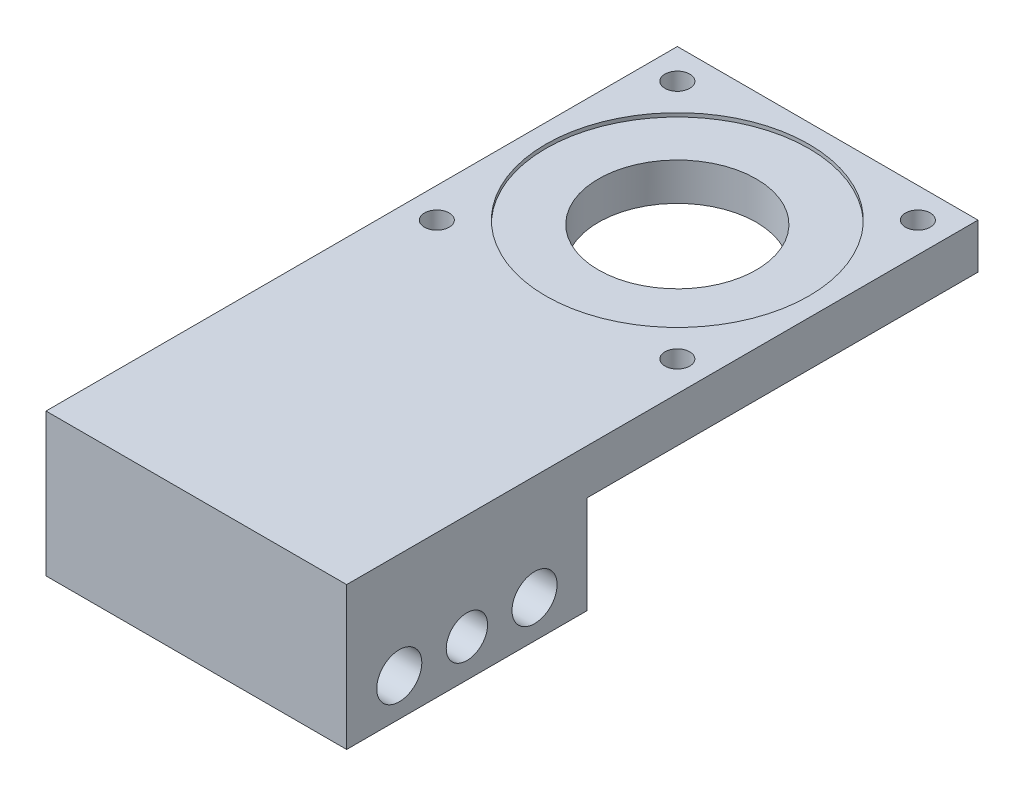
ISO-10303-21;
HEADER;
FILE_DESCRIPTION(('STEP AP214'),'2;1');
FILE_NAME('part.step','',(''),(''),'','','');
FILE_SCHEMA(('AUTOMOTIVE_DESIGN { 1 0 10303 214 1 1 1 1 }'));
ENDSEC;
DATA;
#1=APPLICATION_CONTEXT('core data for automotive mechanical design processes');
#2=APPLICATION_PROTOCOL_DEFINITION('international standard','automotive_design',2000,#1);
#3=PRODUCT_CONTEXT('',#1,'mechanical');
#4=PRODUCT('Part','Part','',(#3));
#5=PRODUCT_RELATED_PRODUCT_CATEGORY('part','',(#4));
#6=PRODUCT_DEFINITION_FORMATION('','',#4);
#7=PRODUCT_DEFINITION_CONTEXT('part definition',#1,'design');
#8=PRODUCT_DEFINITION('design','',#6,#7);
#9=PRODUCT_DEFINITION_SHAPE('','',#8);
#10=(LENGTH_UNIT() NAMED_UNIT(*) SI_UNIT(.MILLI.,.METRE.));
#11=(NAMED_UNIT(*) PLANE_ANGLE_UNIT() SI_UNIT($,.RADIAN.));
#12=(NAMED_UNIT(*) SI_UNIT($,.STERADIAN.) SOLID_ANGLE_UNIT());
#13=UNCERTAINTY_MEASURE_WITH_UNIT(LENGTH_MEASURE(1.E-05),#10,'distance_accuracy_value','');
#14=(GEOMETRIC_REPRESENTATION_CONTEXT(3) GLOBAL_UNCERTAINTY_ASSIGNED_CONTEXT((#13)) GLOBAL_UNIT_ASSIGNED_CONTEXT((#10,
#11,#12)) REPRESENTATION_CONTEXT('',''));
#15=CARTESIAN_POINT('',(0.,0.,0.));
#16=DIRECTION('',(0.,0.,1.));
#17=DIRECTION('',(1.,0.,0.));
#18=AXIS2_PLACEMENT_3D('',#15,#16,#17);
#19=CARTESIAN_POINT('',(0.,6.,0.));
#20=DIRECTION('',(0.,-1.,0.));
#21=DIRECTION('',(0.,0.,-1.));
#22=AXIS2_PLACEMENT_3D('',#19,#20,#21);
#23=CYLINDRICAL_SURFACE('',#22,10.5);
#24=CARTESIAN_POINT('',(0.,5.5,0.));
#25=DIRECTION('',(0.,1.,0.));
#26=DIRECTION('',(0.,0.,1.));
#27=AXIS2_PLACEMENT_3D('',#24,#25,#26);
#28=CIRCLE('',#27,10.5);
#29=CARTESIAN_POINT('',(0.,5.5,10.5));
#30=VERTEX_POINT('',#29);
#31=EDGE_CURVE('E173',#30,#30,#28,.T.);
#32=ORIENTED_EDGE('',*,*,#31,.T.);
#33=EDGE_LOOP('',(#32));
#34=FACE_BOUND('',#33,.T.);
#35=CARTESIAN_POINT('',(0.,0.5,0.));
#36=DIRECTION('',(0.,-1.,0.));
#37=DIRECTION('',(0.,0.,-1.));
#38=AXIS2_PLACEMENT_3D('',#35,#36,#37);
#39=CIRCLE('',#38,10.5);
#40=CARTESIAN_POINT('',(0.,0.5,-10.5));
#41=VERTEX_POINT('',#40);
#42=EDGE_CURVE('E59',#41,#41,#39,.T.);
#43=ORIENTED_EDGE('',*,*,#42,.T.);
#44=EDGE_LOOP('',(#43));
#45=FACE_BOUND('',#44,.T.);
#46=ADVANCED_FACE('F55',(#34,#45),#23,.F.);
#47=CARTESIAN_POINT('',(0.,0.,0.));
#48=DIRECTION('',(0.,1.,0.));
#49=DIRECTION('',(0.,0.,1.));
#50=AXIS2_PLACEMENT_3D('',#47,#48,#49);
#51=PLANE('',#50);
#52=CARTESIAN_POINT('',(0.,0.,0.));
#53=DIRECTION('',(0.,-1.,0.));
#54=DIRECTION('',(0.,0.,-1.));
#55=AXIS2_PLACEMENT_3D('',#52,#53,#54);
#56=CIRCLE('',#55,17.5);
#57=CARTESIAN_POINT('',(0.,0.,-17.5));
#58=VERTEX_POINT('',#57);
#59=EDGE_CURVE('E196',#58,#58,#56,.T.);
#60=ORIENTED_EDGE('',*,*,#59,.F.);
#61=EDGE_LOOP('',(#60));
#62=FACE_BOUND('',#61,.T.);
#63=CARTESIAN_POINT('',(-16.,0.,-16.));
#64=DIRECTION('',(0.,-1.,0.));
#65=DIRECTION('',(0.,0.,-1.));
#66=AXIS2_PLACEMENT_3D('',#63,#64,#65);
#67=CIRCLE('',#66,1.65);
#68=CARTESIAN_POINT('',(-16.,0.,-17.65));
#69=VERTEX_POINT('',#68);
#70=EDGE_CURVE('E176',#69,#69,#67,.T.);
#71=ORIENTED_EDGE('',*,*,#70,.F.);
#72=EDGE_LOOP('',(#71));
#73=FACE_BOUND('',#72,.T.);
#74=CARTESIAN_POINT('',(16.,0.,-16.));
#75=DIRECTION('',(0.,-1.,0.));
#76=DIRECTION('',(0.,0.,-1.));
#77=AXIS2_PLACEMENT_3D('',#74,#75,#76);
#78=CIRCLE('',#77,1.65);
#79=CARTESIAN_POINT('',(16.,0.,-17.65));
#80=VERTEX_POINT('',#79);
#81=EDGE_CURVE('E202',#80,#80,#78,.T.);
#82=ORIENTED_EDGE('',*,*,#81,.F.);
#83=EDGE_LOOP('',(#82));
#84=FACE_BOUND('',#83,.T.);
#85=CARTESIAN_POINT('',(16.,0.,16.));
#86=DIRECTION('',(0.,-1.,0.));
#87=DIRECTION('',(0.,0.,-1.));
#88=AXIS2_PLACEMENT_3D('',#85,#86,#87);
#89=CIRCLE('',#88,1.65);
#90=CARTESIAN_POINT('',(16.,0.,14.35));
#91=VERTEX_POINT('',#90);
#92=EDGE_CURVE('E210',#91,#91,#89,.T.);
#93=ORIENTED_EDGE('',*,*,#92,.F.);
#94=EDGE_LOOP('',(#93));
#95=FACE_BOUND('',#94,.T.);
#96=CARTESIAN_POINT('',(-16.,0.,16.));
#97=DIRECTION('',(0.,-1.,0.));
#98=DIRECTION('',(0.,0.,-1.));
#99=AXIS2_PLACEMENT_3D('',#96,#97,#98);
#100=CIRCLE('',#99,1.65);
#101=CARTESIAN_POINT('',(-16.,0.,14.35));
#102=VERTEX_POINT('',#101);
#103=EDGE_CURVE('E218',#102,#102,#100,.T.);
#104=ORIENTED_EDGE('',*,*,#103,.F.);
#105=EDGE_LOOP('',(#104));
#106=FACE_BOUND('',#105,.T.);
#107=DIRECTION('',(1.,0.,0.));
#108=VECTOR('',#107,1.);
#109=CARTESIAN_POINT('',(-20.,0.,32.));
#110=LINE('',#109,#108);
#111=CARTESIAN_POINT('',(-20.,0.,32.));
#112=VERTEX_POINT('',#111);
#113=CARTESIAN_POINT('',(20.,0.,32.));
#114=VERTEX_POINT('',#113);
#115=EDGE_CURVE('E73',#112,#114,#110,.T.);
#116=ORIENTED_EDGE('',*,*,#115,.F.);
#117=DIRECTION('',(0.,0.,1.));
#118=VECTOR('',#117,1.);
#119=CARTESIAN_POINT('',(-20.,0.,-20.));
#120=LINE('',#119,#118);
#121=CARTESIAN_POINT('',(-20.,0.,-20.));
#122=VERTEX_POINT('',#121);
#123=EDGE_CURVE('E140',#122,#112,#120,.T.);
#124=ORIENTED_EDGE('',*,*,#123,.F.);
#125=DIRECTION('',(-1.,0.,0.));
#126=VECTOR('',#125,1.);
#127=CARTESIAN_POINT('',(20.,0.,-20.));
#128=LINE('',#127,#126);
#129=CARTESIAN_POINT('',(20.,0.,-20.));
#130=VERTEX_POINT('',#129);
#131=EDGE_CURVE('E142',#130,#122,#128,.T.);
#132=ORIENTED_EDGE('',*,*,#131,.F.);
#133=DIRECTION('',(0.,0.,-1.));
#134=VECTOR('',#133,1.);
#135=CARTESIAN_POINT('',(20.,0.,64.));
#136=LINE('',#135,#134);
#137=EDGE_CURVE('E95',#114,#130,#136,.T.);
#138=ORIENTED_EDGE('',*,*,#137,.F.);
#139=EDGE_LOOP('',(#116,#124,#132,#138));
#140=FACE_BOUND('',#139,.T.);
#141=ADVANCED_FACE('F265',(#62,#73,#84,#95,#106,#140),#51,.F.);
#142=CARTESIAN_POINT('',(0.,6.,0.));
#143=DIRECTION('',(0.,1.,0.));
#144=DIRECTION('',(0.,0.,1.));
#145=AXIS2_PLACEMENT_3D('',#142,#143,#144);
#146=PLANE('',#145);
#147=CARTESIAN_POINT('',(0.,6.,0.));
#148=DIRECTION('',(0.,1.,0.));
#149=DIRECTION('',(0.,0.,1.));
#150=AXIS2_PLACEMENT_3D('',#147,#148,#149);
#151=CIRCLE('',#150,17.5);
#152=CARTESIAN_POINT('',(0.,6.,17.5));
#153=VERTEX_POINT('',#152);
#154=EDGE_CURVE('E187',#153,#153,#151,.T.);
#155=ORIENTED_EDGE('',*,*,#154,.F.);
#156=EDGE_LOOP('',(#155));
#157=FACE_BOUND('',#156,.T.);
#158=CARTESIAN_POINT('',(-16.,6.,-16.));
#159=DIRECTION('',(0.,-1.,0.));
#160=DIRECTION('',(0.,0.,-1.));
#161=AXIS2_PLACEMENT_3D('',#158,#159,#160);
#162=CIRCLE('',#161,1.65);
#163=CARTESIAN_POINT('',(-16.,6.,-17.65));
#164=VERTEX_POINT('',#163);
#165=EDGE_CURVE('E184',#164,#164,#162,.T.);
#166=ORIENTED_EDGE('',*,*,#165,.T.);
#167=EDGE_LOOP('',(#166));
#168=FACE_BOUND('',#167,.T.);
#169=CARTESIAN_POINT('',(16.,6.,-16.));
#170=DIRECTION('',(0.,-1.,0.));
#171=DIRECTION('',(0.,0.,-1.));
#172=AXIS2_PLACEMENT_3D('',#169,#170,#171);
#173=CIRCLE('',#172,1.65);
#174=CARTESIAN_POINT('',(16.,6.,-17.65));
#175=VERTEX_POINT('',#174);
#176=EDGE_CURVE('E206',#175,#175,#173,.T.);
#177=ORIENTED_EDGE('',*,*,#176,.T.);
#178=EDGE_LOOP('',(#177));
#179=FACE_BOUND('',#178,.T.);
#180=CARTESIAN_POINT('',(16.,6.,16.));
#181=DIRECTION('',(0.,-1.,0.));
#182=DIRECTION('',(0.,0.,-1.));
#183=AXIS2_PLACEMENT_3D('',#180,#181,#182);
#184=CIRCLE('',#183,1.65);
#185=CARTESIAN_POINT('',(16.,6.,14.35));
#186=VERTEX_POINT('',#185);
#187=EDGE_CURVE('E214',#186,#186,#184,.T.);
#188=ORIENTED_EDGE('',*,*,#187,.T.);
#189=EDGE_LOOP('',(#188));
#190=FACE_BOUND('',#189,.T.);
#191=CARTESIAN_POINT('',(-16.,6.,16.));
#192=DIRECTION('',(0.,-1.,0.));
#193=DIRECTION('',(0.,0.,-1.));
#194=AXIS2_PLACEMENT_3D('',#191,#192,#193);
#195=CIRCLE('',#194,1.65);
#196=CARTESIAN_POINT('',(-16.,6.,14.35));
#197=VERTEX_POINT('',#196);
#198=EDGE_CURVE('E222',#197,#197,#195,.T.);
#199=ORIENTED_EDGE('',*,*,#198,.T.);
#200=EDGE_LOOP('',(#199));
#201=FACE_BOUND('',#200,.T.);
#202=DIRECTION('',(-1.,0.,0.));
#203=VECTOR('',#202,1.);
#204=CARTESIAN_POINT('',(20.,6.,-20.));
#205=LINE('',#204,#203);
#206=CARTESIAN_POINT('',(20.,6.,-20.));
#207=VERTEX_POINT('',#206);
#208=CARTESIAN_POINT('',(-20.,6.,-20.));
#209=VERTEX_POINT('',#208);
#210=EDGE_CURVE('E152',#207,#209,#205,.T.);
#211=ORIENTED_EDGE('',*,*,#210,.T.);
#212=DIRECTION('',(0.,0.,1.));
#213=VECTOR('',#212,1.);
#214=CARTESIAN_POINT('',(-20.,6.,-20.));
#215=LINE('',#214,#213);
#216=CARTESIAN_POINT('',(-20.,6.,64.));
#217=VERTEX_POINT('',#216);
#218=EDGE_CURVE('E102',#209,#217,#215,.T.);
#219=ORIENTED_EDGE('',*,*,#218,.T.);
#220=DIRECTION('',(1.,0.,0.));
#221=VECTOR('',#220,1.);
#222=CARTESIAN_POINT('',(-20.,6.,64.));
#223=LINE('',#222,#221);
#224=CARTESIAN_POINT('',(20.,6.,64.));
#225=VERTEX_POINT('',#224);
#226=EDGE_CURVE('E157',#217,#225,#223,.T.);
#227=ORIENTED_EDGE('',*,*,#226,.T.);
#228=DIRECTION('',(0.,0.,-1.));
#229=VECTOR('',#228,1.);
#230=CARTESIAN_POINT('',(20.,6.,64.));
#231=LINE('',#230,#229);
#232=EDGE_CURVE('E82',#225,#207,#231,.T.);
#233=ORIENTED_EDGE('',*,*,#232,.T.);
#234=EDGE_LOOP('',(#211,#219,#227,#233));
#235=FACE_BOUND('',#234,.T.);
#236=ADVANCED_FACE('F260',(#157,#168,#179,#190,#201,#235),#146,.T.);
#237=CARTESIAN_POINT('',(20.,6.,-20.));
#238=DIRECTION('',(0.,0.,1.));
#239=DIRECTION('',(1.,0.,0.));
#240=AXIS2_PLACEMENT_3D('',#237,#238,#239);
#241=PLANE('',#240);
#242=ORIENTED_EDGE('',*,*,#131,.T.);
#243=DIRECTION('',(0.,-1.,0.));
#244=VECTOR('',#243,1.);
#245=CARTESIAN_POINT('',(-20.,6.,-20.));
#246=LINE('',#245,#244);
#247=EDGE_CURVE('E13',#209,#122,#246,.T.);
#248=ORIENTED_EDGE('',*,*,#247,.F.);
#249=ORIENTED_EDGE('',*,*,#210,.F.);
#250=DIRECTION('',(0.,-1.,0.));
#251=VECTOR('',#250,1.);
#252=CARTESIAN_POINT('',(20.,6.,-20.));
#253=LINE('',#252,#251);
#254=EDGE_CURVE('E161',#207,#130,#253,.T.);
#255=ORIENTED_EDGE('',*,*,#254,.T.);
#256=EDGE_LOOP('',(#242,#248,#249,#255));
#257=FACE_BOUND('',#256,.T.);
#258=ADVANCED_FACE('F57',(#257),#241,.F.);
#259=CARTESIAN_POINT('',(-20.,6.,-20.));
#260=DIRECTION('',(1.,0.,0.));
#261=DIRECTION('',(0.,0.,-1.));
#262=AXIS2_PLACEMENT_3D('',#259,#260,#261);
#263=PLANE('',#262);
#264=CARTESIAN_POINT('',(-20.,-8.,48.));
#265=DIRECTION('',(-1.,0.,0.));
#266=DIRECTION('',(0.,0.,1.));
#267=AXIS2_PLACEMENT_3D('',#264,#265,#266);
#268=CIRCLE('',#267,2.75);
#269=CARTESIAN_POINT('',(-20.,-8.,50.75));
#270=VERTEX_POINT('',#269);
#271=EDGE_CURVE('E226',#270,#270,#268,.T.);
#272=ORIENTED_EDGE('',*,*,#271,.F.);
#273=EDGE_LOOP('',(#272));
#274=FACE_BOUND('',#273,.T.);
#275=CARTESIAN_POINT('',(-20.,-8.,57.));
#276=DIRECTION('',(1.,0.,0.));
#277=DIRECTION('',(0.,0.,-1.));
#278=AXIS2_PLACEMENT_3D('',#275,#276,#277);
#279=CIRCLE('',#278,2.99999999999999);
#280=CARTESIAN_POINT('',(-20.,-8.,54.));
#281=VERTEX_POINT('',#280);
#282=EDGE_CURVE('E238',#281,#281,#279,.T.);
#283=ORIENTED_EDGE('',*,*,#282,.T.);
#284=EDGE_LOOP('',(#283));
#285=FACE_BOUND('',#284,.T.);
#286=CARTESIAN_POINT('',(-20.,-8.,39.));
#287=DIRECTION('',(1.,0.,0.));
#288=DIRECTION('',(0.,0.,-1.));
#289=AXIS2_PLACEMENT_3D('',#286,#287,#288);
#290=CIRCLE('',#289,2.99999999999999);
#291=CARTESIAN_POINT('',(-20.,-8.,36.));
#292=VERTEX_POINT('',#291);
#293=EDGE_CURVE('E246',#292,#292,#290,.T.);
#294=ORIENTED_EDGE('',*,*,#293,.T.);
#295=EDGE_LOOP('',(#294));
#296=FACE_BOUND('',#295,.T.);
#297=ORIENTED_EDGE('',*,*,#123,.T.);
#298=DIRECTION('',(0.,1.,0.));
#299=VECTOR('',#298,1.);
#300=CARTESIAN_POINT('',(-20.,-13.,32.));
#301=LINE('',#300,#299);
#302=CARTESIAN_POINT('',(-20.,-13.,32.));
#303=VERTEX_POINT('',#302);
#304=EDGE_CURVE('E123',#303,#112,#301,.T.);
#305=ORIENTED_EDGE('',*,*,#304,.F.);
#306=DIRECTION('',(0.,0.,-1.));
#307=VECTOR('',#306,1.);
#308=CARTESIAN_POINT('',(-20.,-13.,64.));
#309=LINE('',#308,#307);
#310=CARTESIAN_POINT('',(-20.,-13.,64.));
#311=VERTEX_POINT('',#310);
#312=EDGE_CURVE('E130',#311,#303,#309,.T.);
#313=ORIENTED_EDGE('',*,*,#312,.F.);
#314=DIRECTION('',(0.,-1.,0.));
#315=VECTOR('',#314,1.);
#316=CARTESIAN_POINT('',(-20.,6.,64.));
#317=LINE('',#316,#315);
#318=EDGE_CURVE('E65',#217,#311,#317,.T.);
#319=ORIENTED_EDGE('',*,*,#318,.F.);
#320=ORIENTED_EDGE('',*,*,#218,.F.);
#321=ORIENTED_EDGE('',*,*,#247,.T.);
#322=EDGE_LOOP('',(#297,#305,#313,#319,#320,#321));
#323=FACE_BOUND('',#322,.T.);
#324=ADVANCED_FACE('F139',(#274,#285,#296,#323),#263,.F.);
#325=CARTESIAN_POINT('',(-20.,6.,64.));
#326=DIRECTION('',(0.,0.,-1.));
#327=DIRECTION('',(-1.,0.,0.));
#328=AXIS2_PLACEMENT_3D('',#325,#326,#327);
#329=PLANE('',#328);
#330=ORIENTED_EDGE('',*,*,#318,.T.);
#331=DIRECTION('',(-1.,0.,0.));
#332=VECTOR('',#331,1.);
#333=CARTESIAN_POINT('',(-20.,-13.,64.));
#334=LINE('',#333,#332);
#335=CARTESIAN_POINT('',(20.,-13.,64.));
#336=VERTEX_POINT('',#335);
#337=EDGE_CURVE('E136',#336,#311,#334,.T.);
#338=ORIENTED_EDGE('',*,*,#337,.F.);
#339=DIRECTION('',(0.,-1.,0.));
#340=VECTOR('',#339,1.);
#341=CARTESIAN_POINT('',(20.,6.,64.));
#342=LINE('',#341,#340);
#343=EDGE_CURVE('E169',#225,#336,#342,.T.);
#344=ORIENTED_EDGE('',*,*,#343,.F.);
#345=ORIENTED_EDGE('',*,*,#226,.F.);
#346=EDGE_LOOP('',(#330,#338,#344,#345));
#347=FACE_BOUND('',#346,.T.);
#348=ADVANCED_FACE('F258',(#347),#329,.F.);
#349=CARTESIAN_POINT('',(20.,6.,64.));
#350=DIRECTION('',(-1.,0.,0.));
#351=DIRECTION('',(0.,0.,1.));
#352=AXIS2_PLACEMENT_3D('',#349,#350,#351);
#353=PLANE('',#352);
#354=CARTESIAN_POINT('',(20.,-8.,48.));
#355=DIRECTION('',(-1.,0.,0.));
#356=DIRECTION('',(0.,0.,1.));
#357=AXIS2_PLACEMENT_3D('',#354,#355,#356);
#358=CIRCLE('',#357,2.74999999999999);
#359=CARTESIAN_POINT('',(20.,-8.,50.75));
#360=VERTEX_POINT('',#359);
#361=EDGE_CURVE('E230',#360,#360,#358,.T.);
#362=ORIENTED_EDGE('',*,*,#361,.T.);
#363=EDGE_LOOP('',(#362));
#364=FACE_BOUND('',#363,.T.);
#365=CARTESIAN_POINT('',(20.,-8.,57.));
#366=DIRECTION('',(1.,0.,0.));
#367=DIRECTION('',(0.,0.,-1.));
#368=AXIS2_PLACEMENT_3D('',#365,#366,#367);
#369=CIRCLE('',#368,3.);
#370=CARTESIAN_POINT('',(20.,-8.,54.));
#371=VERTEX_POINT('',#370);
#372=EDGE_CURVE('E234',#371,#371,#369,.T.);
#373=ORIENTED_EDGE('',*,*,#372,.F.);
#374=EDGE_LOOP('',(#373));
#375=FACE_BOUND('',#374,.T.);
#376=CARTESIAN_POINT('',(20.,-8.,39.));
#377=DIRECTION('',(1.,0.,0.));
#378=DIRECTION('',(0.,0.,-1.));
#379=AXIS2_PLACEMENT_3D('',#376,#377,#378);
#380=CIRCLE('',#379,3.);
#381=CARTESIAN_POINT('',(20.,-8.,36.));
#382=VERTEX_POINT('',#381);
#383=EDGE_CURVE('E242',#382,#382,#380,.T.);
#384=ORIENTED_EDGE('',*,*,#383,.F.);
#385=EDGE_LOOP('',(#384));
#386=FACE_BOUND('',#385,.T.);
#387=ORIENTED_EDGE('',*,*,#343,.T.);
#388=DIRECTION('',(0.,0.,1.));
#389=VECTOR('',#388,1.);
#390=CARTESIAN_POINT('',(20.,-13.,64.));
#391=LINE('',#390,#389);
#392=CARTESIAN_POINT('',(20.,-13.,32.));
#393=VERTEX_POINT('',#392);
#394=EDGE_CURVE('E129',#393,#336,#391,.T.);
#395=ORIENTED_EDGE('',*,*,#394,.F.);
#396=DIRECTION('',(0.,1.,0.));
#397=VECTOR('',#396,1.);
#398=CARTESIAN_POINT('',(20.,-13.,32.));
#399=LINE('',#398,#397);
#400=EDGE_CURVE('E124',#393,#114,#399,.T.);
#401=ORIENTED_EDGE('',*,*,#400,.T.);
#402=ORIENTED_EDGE('',*,*,#137,.T.);
#403=ORIENTED_EDGE('',*,*,#254,.F.);
#404=ORIENTED_EDGE('',*,*,#232,.F.);
#405=EDGE_LOOP('',(#387,#395,#401,#402,#403,#404));
#406=FACE_BOUND('',#405,.T.);
#407=ADVANCED_FACE('F255',(#364,#375,#386,#406),#353,.F.);
#408=CARTESIAN_POINT('',(-20.,-13.,32.));
#409=DIRECTION('',(0.,0.,1.));
#410=DIRECTION('',(1.,0.,0.));
#411=AXIS2_PLACEMENT_3D('',#408,#409,#410);
#412=PLANE('',#411);
#413=ORIENTED_EDGE('',*,*,#115,.T.);
#414=ORIENTED_EDGE('',*,*,#400,.F.);
#415=DIRECTION('',(1.,0.,0.));
#416=VECTOR('',#415,1.);
#417=CARTESIAN_POINT('',(-20.,-13.,32.));
#418=LINE('',#417,#416);
#419=EDGE_CURVE('E119',#303,#393,#418,.T.);
#420=ORIENTED_EDGE('',*,*,#419,.F.);
#421=ORIENTED_EDGE('',*,*,#304,.T.);
#422=EDGE_LOOP('',(#413,#414,#420,#421));
#423=FACE_BOUND('',#422,.T.);
#424=ADVANCED_FACE('F121',(#423),#412,.F.);
#425=CARTESIAN_POINT('',(0.,-13.,0.));
#426=DIRECTION('',(0.,-1.,0.));
#427=DIRECTION('',(0.,0.,-1.));
#428=AXIS2_PLACEMENT_3D('',#425,#426,#427);
#429=PLANE('',#428);
#430=ORIENTED_EDGE('',*,*,#312,.T.);
#431=ORIENTED_EDGE('',*,*,#419,.T.);
#432=ORIENTED_EDGE('',*,*,#394,.T.);
#433=ORIENTED_EDGE('',*,*,#337,.T.);
#434=EDGE_LOOP('',(#430,#431,#432,#433));
#435=FACE_BOUND('',#434,.T.);
#436=ADVANCED_FACE('F134',(#435),#429,.T.);
#437=CARTESIAN_POINT('',(20.,-8.,39.));
#438=DIRECTION('',(1.,0.,0.));
#439=DIRECTION('',(0.,0.,-1.));
#440=AXIS2_PLACEMENT_3D('',#437,#438,#439);
#441=CYLINDRICAL_SURFACE('',#440,2.99999999999999);
#442=ORIENTED_EDGE('',*,*,#293,.F.);
#443=EDGE_LOOP('',(#442));
#444=FACE_BOUND('',#443,.T.);
#445=ORIENTED_EDGE('',*,*,#383,.T.);
#446=EDGE_LOOP('',(#445));
#447=FACE_BOUND('',#446,.T.);
#448=ADVANCED_FACE('F294',(#444,#447),#441,.F.);
#449=CARTESIAN_POINT('',(20.,-8.,57.));
#450=DIRECTION('',(1.,0.,0.));
#451=DIRECTION('',(0.,0.,-1.));
#452=AXIS2_PLACEMENT_3D('',#449,#450,#451);
#453=CYLINDRICAL_SURFACE('',#452,2.99999999999999);
#454=ORIENTED_EDGE('',*,*,#282,.F.);
#455=EDGE_LOOP('',(#454));
#456=FACE_BOUND('',#455,.T.);
#457=ORIENTED_EDGE('',*,*,#372,.T.);
#458=EDGE_LOOP('',(#457));
#459=FACE_BOUND('',#458,.T.);
#460=ADVANCED_FACE('F297',(#456,#459),#453,.F.);
#461=CARTESIAN_POINT('',(-20.,-8.,48.));
#462=DIRECTION('',(-1.,0.,0.));
#463=DIRECTION('',(0.,0.,1.));
#464=AXIS2_PLACEMENT_3D('',#461,#462,#463);
#465=CYLINDRICAL_SURFACE('',#464,2.74999999999999);
#466=ORIENTED_EDGE('',*,*,#361,.F.);
#467=EDGE_LOOP('',(#466));
#468=FACE_BOUND('',#467,.T.);
#469=ORIENTED_EDGE('',*,*,#271,.T.);
#470=EDGE_LOOP('',(#469));
#471=FACE_BOUND('',#470,.T.);
#472=ADVANCED_FACE('F305',(#468,#471),#465,.F.);
#473=CARTESIAN_POINT('',(-16.,0.,16.));
#474=DIRECTION('',(0.,-1.,0.));
#475=DIRECTION('',(0.,0.,-1.));
#476=AXIS2_PLACEMENT_3D('',#473,#474,#475);
#477=CYLINDRICAL_SURFACE('',#476,1.65);
#478=ORIENTED_EDGE('',*,*,#198,.F.);
#479=EDGE_LOOP('',(#478));
#480=FACE_BOUND('',#479,.T.);
#481=ORIENTED_EDGE('',*,*,#103,.T.);
#482=EDGE_LOOP('',(#481));
#483=FACE_BOUND('',#482,.T.);
#484=ADVANCED_FACE('F356',(#480,#483),#477,.F.);
#485=CARTESIAN_POINT('',(16.,0.,16.));
#486=DIRECTION('',(0.,-1.,0.));
#487=DIRECTION('',(0.,0.,-1.));
#488=AXIS2_PLACEMENT_3D('',#485,#486,#487);
#489=CYLINDRICAL_SURFACE('',#488,1.65);
#490=ORIENTED_EDGE('',*,*,#187,.F.);
#491=EDGE_LOOP('',(#490));
#492=FACE_BOUND('',#491,.T.);
#493=ORIENTED_EDGE('',*,*,#92,.T.);
#494=EDGE_LOOP('',(#493));
#495=FACE_BOUND('',#494,.T.);
#496=ADVANCED_FACE('F366',(#492,#495),#489,.F.);
#497=CARTESIAN_POINT('',(16.,0.,-16.));
#498=DIRECTION('',(0.,-1.,0.));
#499=DIRECTION('',(0.,0.,-1.));
#500=AXIS2_PLACEMENT_3D('',#497,#498,#499);
#501=CYLINDRICAL_SURFACE('',#500,1.65);
#502=ORIENTED_EDGE('',*,*,#176,.F.);
#503=EDGE_LOOP('',(#502));
#504=FACE_BOUND('',#503,.T.);
#505=ORIENTED_EDGE('',*,*,#81,.T.);
#506=EDGE_LOOP('',(#505));
#507=FACE_BOUND('',#506,.T.);
#508=ADVANCED_FACE('F377',(#504,#507),#501,.F.);
#509=CARTESIAN_POINT('',(-16.,0.,-16.));
#510=DIRECTION('',(0.,-1.,0.));
#511=DIRECTION('',(0.,0.,-1.));
#512=AXIS2_PLACEMENT_3D('',#509,#510,#511);
#513=CYLINDRICAL_SURFACE('',#512,1.65);
#514=ORIENTED_EDGE('',*,*,#165,.F.);
#515=EDGE_LOOP('',(#514));
#516=FACE_BOUND('',#515,.T.);
#517=ORIENTED_EDGE('',*,*,#70,.T.);
#518=EDGE_LOOP('',(#517));
#519=FACE_BOUND('',#518,.T.);
#520=ADVANCED_FACE('F388',(#516,#519),#513,.F.);
#521=CARTESIAN_POINT('',(0.,5.5,0.));
#522=DIRECTION('',(0.,1.,0.));
#523=DIRECTION('',(0.,0.,1.));
#524=AXIS2_PLACEMENT_3D('',#521,#522,#523);
#525=CYLINDRICAL_SURFACE('',#524,17.5);
#526=CARTESIAN_POINT('',(0.,5.5,0.));
#527=DIRECTION('',(0.,1.,0.));
#528=DIRECTION('',(0.,0.,1.));
#529=AXIS2_PLACEMENT_3D('',#526,#527,#528);
#530=CIRCLE('',#529,17.5);
#531=CARTESIAN_POINT('',(0.,5.5,17.5));
#532=VERTEX_POINT('',#531);
#533=EDGE_CURVE('E177',#532,#532,#530,.T.);
#534=ORIENTED_EDGE('',*,*,#533,.F.);
#535=EDGE_LOOP('',(#534));
#536=FACE_BOUND('',#535,.T.);
#537=ORIENTED_EDGE('',*,*,#154,.T.);
#538=EDGE_LOOP('',(#537));
#539=FACE_BOUND('',#538,.T.);
#540=ADVANCED_FACE('F399',(#536,#539),#525,.F.);
#541=CARTESIAN_POINT('',(0.,5.5,0.));
#542=DIRECTION('',(0.,1.,0.));
#543=DIRECTION('',(0.,0.,1.));
#544=AXIS2_PLACEMENT_3D('',#541,#542,#543);
#545=PLANE('',#544);
#546=ORIENTED_EDGE('',*,*,#31,.F.);
#547=EDGE_LOOP('',(#546));
#548=FACE_BOUND('',#547,.T.);
#549=ORIENTED_EDGE('',*,*,#533,.T.);
#550=EDGE_LOOP('',(#549));
#551=FACE_BOUND('',#550,.T.);
#552=ADVANCED_FACE('F418',(#548,#551),#545,.T.);
#553=CARTESIAN_POINT('',(0.,0.5,0.));
#554=DIRECTION('',(0.,-1.,0.));
#555=DIRECTION('',(0.,0.,-1.));
#556=AXIS2_PLACEMENT_3D('',#553,#554,#555);
#557=CYLINDRICAL_SURFACE('',#556,17.5);
#558=CARTESIAN_POINT('',(0.,0.5,0.));
#559=DIRECTION('',(0.,-1.,0.));
#560=DIRECTION('',(0.,0.,-1.));
#561=AXIS2_PLACEMENT_3D('',#558,#559,#560);
#562=CIRCLE('',#561,17.5);
#563=CARTESIAN_POINT('',(0.,0.5,-17.5));
#564=VERTEX_POINT('',#563);
#565=EDGE_CURVE('E489',#564,#564,#562,.T.);
#566=ORIENTED_EDGE('',*,*,#565,.F.);
#567=EDGE_LOOP('',(#566));
#568=FACE_BOUND('',#567,.T.);
#569=ORIENTED_EDGE('',*,*,#59,.T.);
#570=EDGE_LOOP('',(#569));
#571=FACE_BOUND('',#570,.T.);
#572=ADVANCED_FACE('F429',(#568,#571),#557,.F.);
#573=CARTESIAN_POINT('',(0.,0.5,0.));
#574=DIRECTION('',(0.,-1.,0.));
#575=DIRECTION('',(0.,0.,-1.));
#576=AXIS2_PLACEMENT_3D('',#573,#574,#575);
#577=PLANE('',#576);
#578=ORIENTED_EDGE('',*,*,#42,.F.);
#579=EDGE_LOOP('',(#578));
#580=FACE_BOUND('',#579,.T.);
#581=ORIENTED_EDGE('',*,*,#565,.T.);
#582=EDGE_LOOP('',(#581));
#583=FACE_BOUND('',#582,.T.);
#584=ADVANCED_FACE('F452',(#580,#583),#577,.T.);
#585=CLOSED_SHELL('',(#46,#141,#236,#258,#324,#348,#407,#424,#436,#448,#460,#472,#484,#496,#508,
#520,#540,#552,#572,#584));
#586=MANIFOLD_SOLID_BREP('B2',#585);
#587=ADVANCED_BREP_SHAPE_REPRESENTATION('',(#18,#586),#14);
#588=SHAPE_DEFINITION_REPRESENTATION(#9,#587);
ENDSEC;
END-ISO-10303-21;
